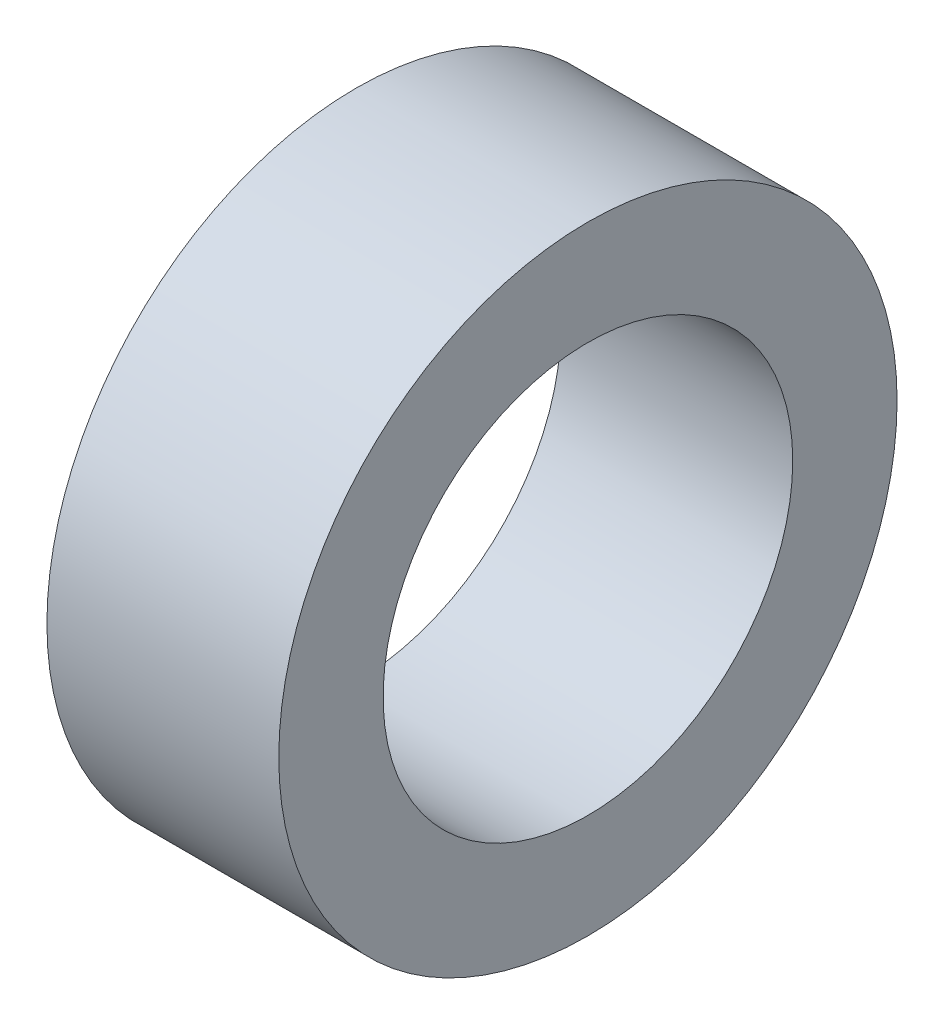
ISO-10303-21;
HEADER;
FILE_DESCRIPTION(('STEP AP214'),'2;1');
FILE_NAME('part.step','',(''),(''),'','','');
FILE_SCHEMA(('AUTOMOTIVE_DESIGN { 1 0 10303 214 1 1 1 1 }'));
ENDSEC;
DATA;
#1=APPLICATION_CONTEXT('core data for automotive mechanical design processes');
#2=APPLICATION_PROTOCOL_DEFINITION('international standard','automotive_design',2000,#1);
#3=PRODUCT_CONTEXT('',#1,'mechanical');
#4=PRODUCT('Part','Part','',(#3));
#5=PRODUCT_RELATED_PRODUCT_CATEGORY('part','',(#4));
#6=PRODUCT_DEFINITION_FORMATION('','',#4);
#7=PRODUCT_DEFINITION_CONTEXT('part definition',#1,'design');
#8=PRODUCT_DEFINITION('design','',#6,#7);
#9=PRODUCT_DEFINITION_SHAPE('','',#8);
#10=(LENGTH_UNIT() NAMED_UNIT(*) SI_UNIT(.MILLI.,.METRE.));
#11=(NAMED_UNIT(*) PLANE_ANGLE_UNIT() SI_UNIT($,.RADIAN.));
#12=(NAMED_UNIT(*) SI_UNIT($,.STERADIAN.) SOLID_ANGLE_UNIT());
#13=UNCERTAINTY_MEASURE_WITH_UNIT(LENGTH_MEASURE(1.E-05),#10,'distance_accuracy_value','');
#14=(GEOMETRIC_REPRESENTATION_CONTEXT(3) GLOBAL_UNCERTAINTY_ASSIGNED_CONTEXT((#13)) GLOBAL_UNIT_ASSIGNED_CONTEXT((#10,
#11,#12)) REPRESENTATION_CONTEXT('',''));
#15=CARTESIAN_POINT('',(0.,0.,0.));
#16=DIRECTION('',(0.,0.,1.));
#17=DIRECTION('',(1.,0.,0.));
#18=AXIS2_PLACEMENT_3D('',#15,#16,#17);
#19=CARTESIAN_POINT('',(3.,0.,0.));
#20=DIRECTION('',(1.,0.,0.));
#21=DIRECTION('',(0.,0.,-1.));
#22=AXIS2_PLACEMENT_3D('',#19,#20,#21);
#23=PLANE('',#22);
#24=CARTESIAN_POINT('',(3.,0.,0.));
#25=DIRECTION('',(1.,0.,0.));
#26=DIRECTION('',(0.,0.,-1.));
#27=AXIS2_PLACEMENT_3D('',#24,#25,#26);
#28=CIRCLE('',#27,4.);
#29=CARTESIAN_POINT('',(3.,0.,-4.));
#30=VERTEX_POINT('',#29);
#31=EDGE_CURVE('E10',#30,#30,#28,.T.);
#32=ORIENTED_EDGE('',*,*,#31,.T.);
#33=EDGE_LOOP('',(#32));
#34=FACE_BOUND('',#33,.T.);
#35=CARTESIAN_POINT('',(3.,0.,0.));
#36=DIRECTION('',(1.,0.,0.));
#37=DIRECTION('',(0.,0.,-1.));
#38=AXIS2_PLACEMENT_3D('',#35,#36,#37);
#39=CIRCLE('',#38,2.65);
#40=CARTESIAN_POINT('',(3.,0.,-2.65));
#41=VERTEX_POINT('',#40);
#42=EDGE_CURVE('E42',#41,#41,#39,.T.);
#43=ORIENTED_EDGE('',*,*,#42,.F.);
#44=EDGE_LOOP('',(#43));
#45=FACE_BOUND('',#44,.T.);
#46=ADVANCED_FACE('F31',(#34,#45),#23,.T.);
#47=CARTESIAN_POINT('',(0.,0.,0.));
#48=DIRECTION('',(1.,0.,0.));
#49=DIRECTION('',(0.,0.,-1.));
#50=AXIS2_PLACEMENT_3D('',#47,#48,#49);
#51=PLANE('',#50);
#52=CARTESIAN_POINT('',(0.,0.,0.));
#53=DIRECTION('',(1.,0.,0.));
#54=DIRECTION('',(0.,0.,-1.));
#55=AXIS2_PLACEMENT_3D('',#52,#53,#54);
#56=CIRCLE('',#55,4.);
#57=CARTESIAN_POINT('',(0.,0.,-4.));
#58=VERTEX_POINT('',#57);
#59=EDGE_CURVE('E35',#58,#58,#56,.T.);
#60=ORIENTED_EDGE('',*,*,#59,.F.);
#61=EDGE_LOOP('',(#60));
#62=FACE_BOUND('',#61,.T.);
#63=CARTESIAN_POINT('',(0.,0.,0.));
#64=DIRECTION('',(1.,0.,0.));
#65=DIRECTION('',(0.,0.,-1.));
#66=AXIS2_PLACEMENT_3D('',#63,#64,#65);
#67=CIRCLE('',#66,2.65);
#68=CARTESIAN_POINT('',(0.,0.,-2.65));
#69=VERTEX_POINT('',#68);
#70=EDGE_CURVE('E44',#69,#69,#67,.T.);
#71=ORIENTED_EDGE('',*,*,#70,.T.);
#72=EDGE_LOOP('',(#71));
#73=FACE_BOUND('',#72,.T.);
#74=ADVANCED_FACE('F54',(#62,#73),#51,.F.);
#75=CARTESIAN_POINT('',(3.,0.,0.));
#76=DIRECTION('',(-1.,0.,0.));
#77=DIRECTION('',(0.,0.,1.));
#78=AXIS2_PLACEMENT_3D('',#75,#76,#77);
#79=CYLINDRICAL_SURFACE('',#78,4.);
#80=ORIENTED_EDGE('',*,*,#31,.F.);
#81=EDGE_LOOP('',(#80));
#82=FACE_BOUND('',#81,.T.);
#83=ORIENTED_EDGE('',*,*,#59,.T.);
#84=EDGE_LOOP('',(#83));
#85=FACE_BOUND('',#84,.T.);
#86=ADVANCED_FACE('F33',(#82,#85),#79,.T.);
#87=CARTESIAN_POINT('',(3.,0.,0.));
#88=DIRECTION('',(-1.,0.,0.));
#89=DIRECTION('',(0.,0.,1.));
#90=AXIS2_PLACEMENT_3D('',#87,#88,#89);
#91=CYLINDRICAL_SURFACE('',#90,2.65);
#92=ORIENTED_EDGE('',*,*,#42,.T.);
#93=EDGE_LOOP('',(#92));
#94=FACE_BOUND('',#93,.T.);
#95=ORIENTED_EDGE('',*,*,#70,.F.);
#96=EDGE_LOOP('',(#95));
#97=FACE_BOUND('',#96,.T.);
#98=ADVANCED_FACE('F50',(#94,#97),#91,.F.);
#99=CLOSED_SHELL('',(#46,#74,#86,#98));
#100=MANIFOLD_SOLID_BREP('B2',#99);
#101=ADVANCED_BREP_SHAPE_REPRESENTATION('',(#18,#100),#14);
#102=SHAPE_DEFINITION_REPRESENTATION(#9,#101);
ENDSEC;
END-ISO-10303-21;
